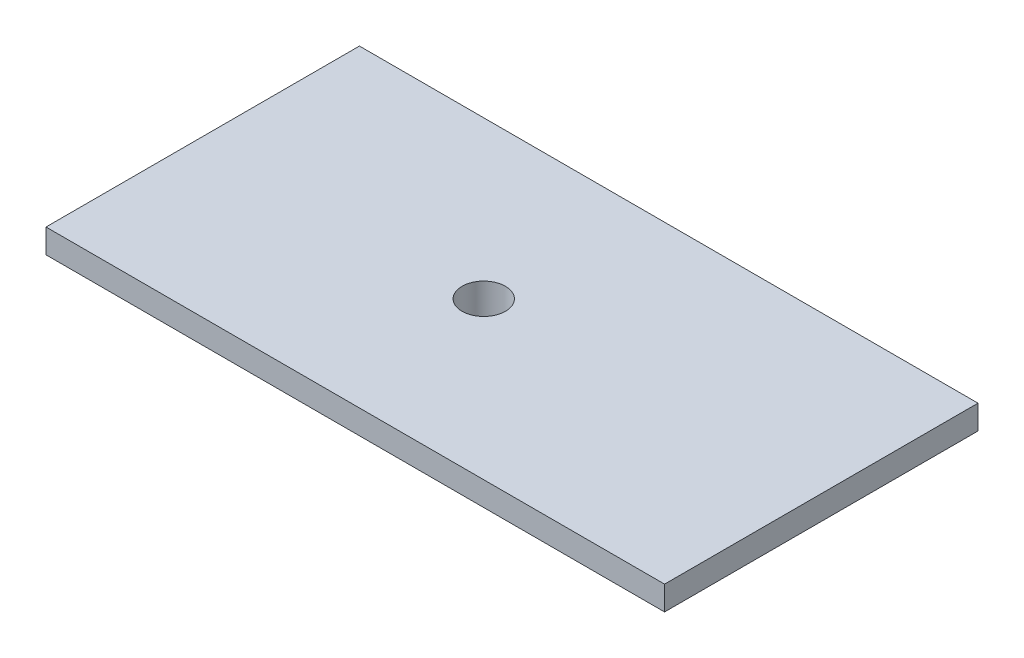
ISO-10303-21;
HEADER;
FILE_DESCRIPTION(('STEP AP214'),'2;1');
FILE_NAME('part.step','',(''),(''),'','','');
FILE_SCHEMA(('AUTOMOTIVE_DESIGN { 1 0 10303 214 1 1 1 1 }'));
ENDSEC;
DATA;
#1=APPLICATION_CONTEXT('core data for automotive mechanical design processes');
#2=APPLICATION_PROTOCOL_DEFINITION('international standard','automotive_design',2000,#1);
#3=PRODUCT_CONTEXT('',#1,'mechanical');
#4=PRODUCT('Part','Part','',(#3));
#5=PRODUCT_RELATED_PRODUCT_CATEGORY('part','',(#4));
#6=PRODUCT_DEFINITION_FORMATION('','',#4);
#7=PRODUCT_DEFINITION_CONTEXT('part definition',#1,'design');
#8=PRODUCT_DEFINITION('design','',#6,#7);
#9=PRODUCT_DEFINITION_SHAPE('','',#8);
#10=(LENGTH_UNIT() NAMED_UNIT(*) SI_UNIT(.MILLI.,.METRE.));
#11=(NAMED_UNIT(*) PLANE_ANGLE_UNIT() SI_UNIT($,.RADIAN.));
#12=(NAMED_UNIT(*) SI_UNIT($,.STERADIAN.) SOLID_ANGLE_UNIT());
#13=UNCERTAINTY_MEASURE_WITH_UNIT(LENGTH_MEASURE(1.E-05),#10,'distance_accuracy_value','');
#14=(GEOMETRIC_REPRESENTATION_CONTEXT(3) GLOBAL_UNCERTAINTY_ASSIGNED_CONTEXT((#13)) GLOBAL_UNIT_ASSIGNED_CONTEXT((#10,
#11,#12)) REPRESENTATION_CONTEXT('',''));
#15=CARTESIAN_POINT('',(0.,0.,0.));
#16=DIRECTION('',(0.,0.,1.));
#17=DIRECTION('',(1.,0.,0.));
#18=AXIS2_PLACEMENT_3D('',#15,#16,#17);
#19=CARTESIAN_POINT('',(0.,0.,0.));
#20=DIRECTION('',(0.,1.,0.));
#21=DIRECTION('',(0.,0.,1.));
#22=AXIS2_PLACEMENT_3D('',#19,#20,#21);
#23=PLANE('',#22);
#24=DIRECTION('',(0.,0.,-1.));
#25=VECTOR('',#24,1.);
#26=CARTESIAN_POINT('',(0.,0.,0.));
#27=LINE('',#26,#25);
#28=CARTESIAN_POINT('',(0.,0.,0.));
#29=VERTEX_POINT('',#28);
#30=CARTESIAN_POINT('',(0.,0.,-65.));
#31=VERTEX_POINT('',#30);
#32=EDGE_CURVE('E130',#29,#31,#27,.T.);
#33=ORIENTED_EDGE('',*,*,#32,.F.);
#34=DIRECTION('',(1.,0.,0.));
#35=VECTOR('',#34,1.);
#36=CARTESIAN_POINT('',(0.,0.,0.));
#37=LINE('',#36,#35);
#38=CARTESIAN_POINT('',(-128.28,0.,0.));
#39=VERTEX_POINT('',#38);
#40=EDGE_CURVE('E143',#39,#29,#37,.T.);
#41=ORIENTED_EDGE('',*,*,#40,.F.);
#42=DIRECTION('',(0.,0.,1.));
#43=VECTOR('',#42,1.);
#44=CARTESIAN_POINT('',(-128.28,0.,0.));
#45=LINE('',#44,#43);
#46=CARTESIAN_POINT('',(-128.28,0.,-65.));
#47=VERTEX_POINT('',#46);
#48=EDGE_CURVE('E151',#47,#39,#45,.T.);
#49=ORIENTED_EDGE('',*,*,#48,.F.);
#50=DIRECTION('',(-1.,0.,0.));
#51=VECTOR('',#50,1.);
#52=CARTESIAN_POINT('',(0.,0.,-65.));
#53=LINE('',#52,#51);
#54=EDGE_CURVE('E133',#31,#47,#53,.T.);
#55=ORIENTED_EDGE('',*,*,#54,.F.);
#56=EDGE_LOOP('',(#33,#41,#49,#55));
#57=FACE_BOUND('',#56,.T.);
#58=DIRECTION('',(0.,0.,-1.));
#59=VECTOR('',#58,1.);
#60=CARTESIAN_POINT('',(-123.18,0.,-5.1));
#61=LINE('',#60,#59);
#62=CARTESIAN_POINT('',(-123.18,0.,-5.1));
#63=VERTEX_POINT('',#62);
#64=CARTESIAN_POINT('',(-123.18,0.,-59.9));
#65=VERTEX_POINT('',#64);
#66=EDGE_CURVE('E129',#63,#65,#61,.T.);
#67=ORIENTED_EDGE('',*,*,#66,.F.);
#68=DIRECTION('',(-1.,0.,0.));
#69=VECTOR('',#68,1.);
#70=CARTESIAN_POINT('',(-123.18,0.,-5.1));
#71=LINE('',#70,#69);
#72=CARTESIAN_POINT('',(-5.09999999999999,0.,-5.1));
#73=VERTEX_POINT('',#72);
#74=EDGE_CURVE('E126',#73,#63,#71,.T.);
#75=ORIENTED_EDGE('',*,*,#74,.F.);
#76=DIRECTION('',(0.,0.,1.));
#77=VECTOR('',#76,1.);
#78=CARTESIAN_POINT('',(-5.09999999999999,0.,-5.1));
#79=LINE('',#78,#77);
#80=CARTESIAN_POINT('',(-5.09999999999999,0.,-59.9));
#81=VERTEX_POINT('',#80);
#82=EDGE_CURVE('E64',#81,#73,#79,.T.);
#83=ORIENTED_EDGE('',*,*,#82,.F.);
#84=DIRECTION('',(1.,0.,0.));
#85=VECTOR('',#84,1.);
#86=CARTESIAN_POINT('',(-123.18,0.,-59.9));
#87=LINE('',#86,#85);
#88=EDGE_CURVE('E59',#65,#81,#87,.T.);
#89=ORIENTED_EDGE('',*,*,#88,.F.);
#90=EDGE_LOOP('',(#67,#75,#83,#89));
#91=FACE_BOUND('',#90,.T.);
#92=ADVANCED_FACE('F44',(#57,#91),#23,.F.);
#93=CARTESIAN_POINT('',(0.,5.,0.));
#94=DIRECTION('',(-1.,0.,0.));
#95=DIRECTION('',(0.,0.,1.));
#96=AXIS2_PLACEMENT_3D('',#93,#94,#95);
#97=PLANE('',#96);
#98=ORIENTED_EDGE('',*,*,#32,.T.);
#99=DIRECTION('',(0.,-1.,0.));
#100=VECTOR('',#99,1.);
#101=CARTESIAN_POINT('',(0.,5.,-65.));
#102=LINE('',#101,#100);
#103=CARTESIAN_POINT('',(0.,5.,-65.));
#104=VERTEX_POINT('',#103);
#105=EDGE_CURVE('E13',#104,#31,#102,.T.);
#106=ORIENTED_EDGE('',*,*,#105,.F.);
#107=DIRECTION('',(0.,0.,-1.));
#108=VECTOR('',#107,1.);
#109=CARTESIAN_POINT('',(0.,5.,0.));
#110=LINE('',#109,#108);
#111=CARTESIAN_POINT('',(0.,5.,0.));
#112=VERTEX_POINT('',#111);
#113=EDGE_CURVE('E139',#112,#104,#110,.T.);
#114=ORIENTED_EDGE('',*,*,#113,.F.);
#115=DIRECTION('',(0.,-1.,0.));
#116=VECTOR('',#115,1.);
#117=CARTESIAN_POINT('',(0.,5.,0.));
#118=LINE('',#117,#116);
#119=EDGE_CURVE('E148',#112,#29,#118,.T.);
#120=ORIENTED_EDGE('',*,*,#119,.T.);
#121=EDGE_LOOP('',(#98,#106,#114,#120));
#122=FACE_BOUND('',#121,.T.);
#123=ADVANCED_FACE('F46',(#122),#97,.F.);
#124=CARTESIAN_POINT('',(0.,5.,-65.));
#125=DIRECTION('',(0.,0.,1.));
#126=DIRECTION('',(1.,0.,0.));
#127=AXIS2_PLACEMENT_3D('',#124,#125,#126);
#128=PLANE('',#127);
#129=ORIENTED_EDGE('',*,*,#54,.T.);
#130=DIRECTION('',(0.,-1.,0.));
#131=VECTOR('',#130,1.);
#132=CARTESIAN_POINT('',(-128.28,5.,-65.));
#133=LINE('',#132,#131);
#134=CARTESIAN_POINT('',(-128.28,5.,-65.));
#135=VERTEX_POINT('',#134);
#136=EDGE_CURVE('E52',#135,#47,#133,.T.);
#137=ORIENTED_EDGE('',*,*,#136,.F.);
#138=DIRECTION('',(-1.,0.,0.));
#139=VECTOR('',#138,1.);
#140=CARTESIAN_POINT('',(0.,5.,-65.));
#141=LINE('',#140,#139);
#142=EDGE_CURVE('E142',#104,#135,#141,.T.);
#143=ORIENTED_EDGE('',*,*,#142,.F.);
#144=ORIENTED_EDGE('',*,*,#105,.T.);
#145=EDGE_LOOP('',(#129,#137,#143,#144));
#146=FACE_BOUND('',#145,.T.);
#147=ADVANCED_FACE('F178',(#146),#128,.F.);
#148=CARTESIAN_POINT('',(-128.28,5.,0.));
#149=DIRECTION('',(1.,0.,0.));
#150=DIRECTION('',(0.,0.,-1.));
#151=AXIS2_PLACEMENT_3D('',#148,#149,#150);
#152=PLANE('',#151);
#153=ORIENTED_EDGE('',*,*,#48,.T.);
#154=DIRECTION('',(0.,-1.,0.));
#155=VECTOR('',#154,1.);
#156=CARTESIAN_POINT('',(-128.28,5.,0.));
#157=LINE('',#156,#155);
#158=CARTESIAN_POINT('',(-128.28,5.,0.));
#159=VERTEX_POINT('',#158);
#160=EDGE_CURVE('E156',#159,#39,#157,.T.);
#161=ORIENTED_EDGE('',*,*,#160,.F.);
#162=DIRECTION('',(0.,0.,1.));
#163=VECTOR('',#162,1.);
#164=CARTESIAN_POINT('',(-128.28,5.,0.));
#165=LINE('',#164,#163);
#166=EDGE_CURVE('E145',#135,#159,#165,.T.);
#167=ORIENTED_EDGE('',*,*,#166,.F.);
#168=ORIENTED_EDGE('',*,*,#136,.T.);
#169=EDGE_LOOP('',(#153,#161,#167,#168));
#170=FACE_BOUND('',#169,.T.);
#171=ADVANCED_FACE('F163',(#170),#152,.F.);
#172=CARTESIAN_POINT('',(0.,5.,0.));
#173=DIRECTION('',(0.,0.,-1.));
#174=DIRECTION('',(-1.,0.,0.));
#175=AXIS2_PLACEMENT_3D('',#172,#173,#174);
#176=PLANE('',#175);
#177=ORIENTED_EDGE('',*,*,#40,.T.);
#178=ORIENTED_EDGE('',*,*,#119,.F.);
#179=DIRECTION('',(1.,0.,0.));
#180=VECTOR('',#179,1.);
#181=CARTESIAN_POINT('',(0.,5.,0.));
#182=LINE('',#181,#180);
#183=EDGE_CURVE('E147',#159,#112,#182,.T.);
#184=ORIENTED_EDGE('',*,*,#183,.F.);
#185=ORIENTED_EDGE('',*,*,#160,.T.);
#186=EDGE_LOOP('',(#177,#178,#184,#185));
#187=FACE_BOUND('',#186,.T.);
#188=ADVANCED_FACE('F171',(#187),#176,.F.);
#189=CARTESIAN_POINT('',(0.,5.,0.));
#190=DIRECTION('',(0.,1.,0.));
#191=DIRECTION('',(0.,0.,1.));
#192=AXIS2_PLACEMENT_3D('',#189,#190,#191);
#193=PLANE('',#192);
#194=CARTESIAN_POINT('',(-70.,5.,-32.5));
#195=DIRECTION('',(0.,1.,0.));
#196=DIRECTION('',(0.,0.,1.));
#197=AXIS2_PLACEMENT_3D('',#194,#195,#196);
#198=CIRCLE('',#197,4.50000000000001);
#199=CARTESIAN_POINT('',(-70.,5.,-28.));
#200=VERTEX_POINT('',#199);
#201=EDGE_CURVE('E202',#200,#200,#198,.T.);
#202=ORIENTED_EDGE('',*,*,#201,.F.);
#203=EDGE_LOOP('',(#202));
#204=FACE_BOUND('',#203,.T.);
#205=ORIENTED_EDGE('',*,*,#113,.T.);
#206=ORIENTED_EDGE('',*,*,#142,.T.);
#207=ORIENTED_EDGE('',*,*,#166,.T.);
#208=ORIENTED_EDGE('',*,*,#183,.T.);
#209=EDGE_LOOP('',(#205,#206,#207,#208));
#210=FACE_BOUND('',#209,.T.);
#211=ADVANCED_FACE('F177',(#204,#210),#193,.T.);
#212=CARTESIAN_POINT('',(-123.18,-5.,-5.1));
#213=DIRECTION('',(1.,0.,0.));
#214=DIRECTION('',(0.,0.,-1.));
#215=AXIS2_PLACEMENT_3D('',#212,#213,#214);
#216=PLANE('',#215);
#217=ORIENTED_EDGE('',*,*,#66,.T.);
#218=DIRECTION('',(0.,1.,0.));
#219=VECTOR('',#218,1.);
#220=CARTESIAN_POINT('',(-123.18,-5.,-59.9));
#221=LINE('',#220,#219);
#222=CARTESIAN_POINT('',(-123.18,-5.,-59.9));
#223=VERTEX_POINT('',#222);
#224=EDGE_CURVE('E110',#223,#65,#221,.T.);
#225=ORIENTED_EDGE('',*,*,#224,.F.);
#226=DIRECTION('',(0.,0.,-1.));
#227=VECTOR('',#226,1.);
#228=CARTESIAN_POINT('',(-123.18,-5.,-5.1));
#229=LINE('',#228,#227);
#230=CARTESIAN_POINT('',(-123.18,-5.,-5.1));
#231=VERTEX_POINT('',#230);
#232=EDGE_CURVE('E117',#231,#223,#229,.T.);
#233=ORIENTED_EDGE('',*,*,#232,.F.);
#234=DIRECTION('',(0.,1.,0.));
#235=VECTOR('',#234,1.);
#236=CARTESIAN_POINT('',(-123.18,-5.,-5.1));
#237=LINE('',#236,#235);
#238=EDGE_CURVE('E211',#231,#63,#237,.T.);
#239=ORIENTED_EDGE('',*,*,#238,.T.);
#240=EDGE_LOOP('',(#217,#225,#233,#239));
#241=FACE_BOUND('',#240,.T.);
#242=ADVANCED_FACE('F128',(#241),#216,.F.);
#243=CARTESIAN_POINT('',(-123.18,-5.,-59.9));
#244=DIRECTION('',(0.,0.,1.));
#245=DIRECTION('',(1.,0.,0.));
#246=AXIS2_PLACEMENT_3D('',#243,#244,#245);
#247=PLANE('',#246);
#248=ORIENTED_EDGE('',*,*,#88,.T.);
#249=DIRECTION('',(0.,1.,0.));
#250=VECTOR('',#249,1.);
#251=CARTESIAN_POINT('',(-5.09999999999999,-5.,-59.9));
#252=LINE('',#251,#250);
#253=CARTESIAN_POINT('',(-5.09999999999999,-5.,-59.9));
#254=VERTEX_POINT('',#253);
#255=EDGE_CURVE('E113',#254,#81,#252,.T.);
#256=ORIENTED_EDGE('',*,*,#255,.F.);
#257=DIRECTION('',(1.,0.,0.));
#258=VECTOR('',#257,1.);
#259=CARTESIAN_POINT('',(-123.18,-5.,-59.9));
#260=LINE('',#259,#258);
#261=EDGE_CURVE('E106',#223,#254,#260,.T.);
#262=ORIENTED_EDGE('',*,*,#261,.F.);
#263=ORIENTED_EDGE('',*,*,#224,.T.);
#264=EDGE_LOOP('',(#248,#256,#262,#263));
#265=FACE_BOUND('',#264,.T.);
#266=ADVANCED_FACE('F108',(#265),#247,.F.);
#267=CARTESIAN_POINT('',(-5.09999999999999,-5.,-5.1));
#268=DIRECTION('',(-1.,0.,0.));
#269=DIRECTION('',(0.,0.,1.));
#270=AXIS2_PLACEMENT_3D('',#267,#268,#269);
#271=PLANE('',#270);
#272=ORIENTED_EDGE('',*,*,#82,.T.);
#273=DIRECTION('',(0.,1.,0.));
#274=VECTOR('',#273,1.);
#275=CARTESIAN_POINT('',(-5.09999999999999,-5.,-5.1));
#276=LINE('',#275,#274);
#277=CARTESIAN_POINT('',(-5.09999999999999,-5.,-5.1));
#278=VERTEX_POINT('',#277);
#279=EDGE_CURVE('E135',#278,#73,#276,.T.);
#280=ORIENTED_EDGE('',*,*,#279,.F.);
#281=DIRECTION('',(0.,0.,1.));
#282=VECTOR('',#281,1.);
#283=CARTESIAN_POINT('',(-5.09999999999999,-5.,-5.1));
#284=LINE('',#283,#282);
#285=EDGE_CURVE('E116',#254,#278,#284,.T.);
#286=ORIENTED_EDGE('',*,*,#285,.F.);
#287=ORIENTED_EDGE('',*,*,#255,.T.);
#288=EDGE_LOOP('',(#272,#280,#286,#287));
#289=FACE_BOUND('',#288,.T.);
#290=ADVANCED_FACE('F222',(#289),#271,.F.);
#291=CARTESIAN_POINT('',(-123.18,-5.,-5.1));
#292=DIRECTION('',(0.,0.,-1.));
#293=DIRECTION('',(-1.,0.,0.));
#294=AXIS2_PLACEMENT_3D('',#291,#292,#293);
#295=PLANE('',#294);
#296=ORIENTED_EDGE('',*,*,#74,.T.);
#297=ORIENTED_EDGE('',*,*,#238,.F.);
#298=DIRECTION('',(-1.,0.,0.));
#299=VECTOR('',#298,1.);
#300=CARTESIAN_POINT('',(-123.18,-5.,-5.1));
#301=LINE('',#300,#299);
#302=EDGE_CURVE('E122',#278,#231,#301,.T.);
#303=ORIENTED_EDGE('',*,*,#302,.F.);
#304=ORIENTED_EDGE('',*,*,#279,.T.);
#305=EDGE_LOOP('',(#296,#297,#303,#304));
#306=FACE_BOUND('',#305,.T.);
#307=ADVANCED_FACE('F220',(#306),#295,.F.);
#308=CARTESIAN_POINT('',(0.,-5.,0.));
#309=DIRECTION('',(0.,-1.,0.));
#310=DIRECTION('',(0.,0.,-1.));
#311=AXIS2_PLACEMENT_3D('',#308,#309,#310);
#312=PLANE('',#311);
#313=CARTESIAN_POINT('',(-70.,-5.,-32.5));
#314=DIRECTION('',(0.,-1.,0.));
#315=DIRECTION('',(0.,0.,-1.));
#316=AXIS2_PLACEMENT_3D('',#313,#314,#315);
#317=CIRCLE('',#316,4.50000000000001);
#318=CARTESIAN_POINT('',(-70.,-5.,-37.));
#319=VERTEX_POINT('',#318);
#320=EDGE_CURVE('E204',#319,#319,#317,.F.);
#321=ORIENTED_EDGE('',*,*,#320,.T.);
#322=EDGE_LOOP('',(#321));
#323=FACE_BOUND('',#322,.T.);
#324=ORIENTED_EDGE('',*,*,#232,.T.);
#325=ORIENTED_EDGE('',*,*,#261,.T.);
#326=ORIENTED_EDGE('',*,*,#285,.T.);
#327=ORIENTED_EDGE('',*,*,#302,.T.);
#328=EDGE_LOOP('',(#324,#325,#326,#327));
#329=FACE_BOUND('',#328,.T.);
#330=ADVANCED_FACE('F120',(#323,#329),#312,.T.);
#331=CARTESIAN_POINT('',(-70.,-5.001,-32.5));
#332=DIRECTION('',(0.,1.,0.));
#333=DIRECTION('',(0.,0.,1.));
#334=AXIS2_PLACEMENT_3D('',#331,#332,#333);
#335=CYLINDRICAL_SURFACE('',#334,4.50000000000001);
#336=ORIENTED_EDGE('',*,*,#320,.F.);
#337=EDGE_LOOP('',(#336));
#338=FACE_BOUND('',#337,.T.);
#339=ORIENTED_EDGE('',*,*,#201,.T.);
#340=EDGE_LOOP('',(#339));
#341=FACE_BOUND('',#340,.T.);
#342=ADVANCED_FACE('F234',(#338,#341),#335,.F.);
#343=CLOSED_SHELL('',(#92,#123,#147,#171,#188,#211,#242,#266,#290,#307,#330,#342));
#344=MANIFOLD_SOLID_BREP('B2',#343);
#345=ADVANCED_BREP_SHAPE_REPRESENTATION('',(#18,#344),#14);
#346=SHAPE_DEFINITION_REPRESENTATION(#9,#345);
ENDSEC;
END-ISO-10303-21;
